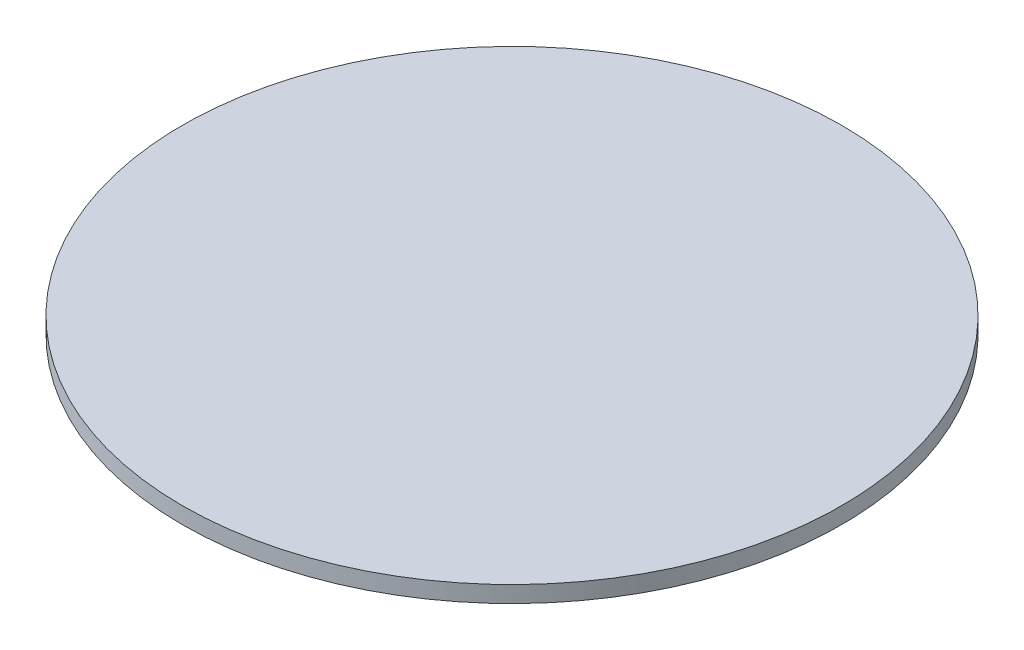
ISO-10303-21;
HEADER;
FILE_DESCRIPTION(('STEP AP214'),'2;1');
FILE_NAME('part.step','',(''),(''),'','','');
FILE_SCHEMA(('AUTOMOTIVE_DESIGN { 1 0 10303 214 1 1 1 1 }'));
ENDSEC;
DATA;
#1=APPLICATION_CONTEXT('core data for automotive mechanical design processes');
#2=APPLICATION_PROTOCOL_DEFINITION('international standard','automotive_design',2000,#1);
#3=PRODUCT_CONTEXT('',#1,'mechanical');
#4=PRODUCT('Part','Part','',(#3));
#5=PRODUCT_RELATED_PRODUCT_CATEGORY('part','',(#4));
#6=PRODUCT_DEFINITION_FORMATION('','',#4);
#7=PRODUCT_DEFINITION_CONTEXT('part definition',#1,'design');
#8=PRODUCT_DEFINITION('design','',#6,#7);
#9=PRODUCT_DEFINITION_SHAPE('','',#8);
#10=(LENGTH_UNIT() NAMED_UNIT(*) SI_UNIT(.MILLI.,.METRE.));
#11=(NAMED_UNIT(*) PLANE_ANGLE_UNIT() SI_UNIT($,.RADIAN.));
#12=(NAMED_UNIT(*) SI_UNIT($,.STERADIAN.) SOLID_ANGLE_UNIT());
#13=UNCERTAINTY_MEASURE_WITH_UNIT(LENGTH_MEASURE(1.E-05),#10,'distance_accuracy_value','');
#14=(GEOMETRIC_REPRESENTATION_CONTEXT(3) GLOBAL_UNCERTAINTY_ASSIGNED_CONTEXT((#13)) GLOBAL_UNIT_ASSIGNED_CONTEXT((#10,
#11,#12)) REPRESENTATION_CONTEXT('',''));
#15=CARTESIAN_POINT('',(0.,0.,0.));
#16=DIRECTION('',(0.,0.,1.));
#17=DIRECTION('',(1.,0.,0.));
#18=AXIS2_PLACEMENT_3D('',#15,#16,#17);
#19=CARTESIAN_POINT('',(0.,2.54,0.));
#20=DIRECTION('',(0.,-1.,0.));
#21=DIRECTION('',(0.,0.,-1.));
#22=AXIS2_PLACEMENT_3D('',#19,#20,#21);
#23=CYLINDRICAL_SURFACE('',#22,101.6);
#24=CARTESIAN_POINT('',(0.,2.54,0.));
#25=DIRECTION('',(0.,1.,0.));
#26=DIRECTION('',(0.,0.,1.));
#27=AXIS2_PLACEMENT_3D('',#24,#25,#26);
#28=CIRCLE('',#27,101.6);
#29=CARTESIAN_POINT('',(0.,2.54,101.6));
#30=VERTEX_POINT('',#29);
#31=EDGE_CURVE('E10',#30,#30,#28,.T.);
#32=ORIENTED_EDGE('',*,*,#31,.F.);
#33=EDGE_LOOP('',(#32));
#34=FACE_BOUND('',#33,.T.);
#35=CARTESIAN_POINT('',(0.,-2.54,0.));
#36=DIRECTION('',(0.,1.,0.));
#37=DIRECTION('',(0.,0.,1.));
#38=AXIS2_PLACEMENT_3D('',#35,#36,#37);
#39=CIRCLE('',#38,101.6);
#40=CARTESIAN_POINT('',(0.,-2.54,101.6));
#41=VERTEX_POINT('',#40);
#42=EDGE_CURVE('E38',#41,#41,#39,.T.);
#43=ORIENTED_EDGE('',*,*,#42,.T.);
#44=EDGE_LOOP('',(#43));
#45=FACE_BOUND('',#44,.T.);
#46=ADVANCED_FACE('F35',(#34,#45),#23,.T.);
#47=CARTESIAN_POINT('',(0.,2.54,0.));
#48=DIRECTION('',(0.,1.,0.));
#49=DIRECTION('',(0.,0.,1.));
#50=AXIS2_PLACEMENT_3D('',#47,#48,#49);
#51=PLANE('',#50);
#52=ORIENTED_EDGE('',*,*,#31,.T.);
#53=EDGE_LOOP('',(#52));
#54=FACE_BOUND('',#53,.T.);
#55=ADVANCED_FACE('F50',(#54),#51,.T.);
#56=CARTESIAN_POINT('',(0.,-2.54,0.));
#57=DIRECTION('',(0.,1.,0.));
#58=DIRECTION('',(0.,0.,1.));
#59=AXIS2_PLACEMENT_3D('',#56,#57,#58);
#60=PLANE('',#59);
#61=ORIENTED_EDGE('',*,*,#42,.F.);
#62=EDGE_LOOP('',(#61));
#63=FACE_BOUND('',#62,.T.);
#64=ADVANCED_FACE('F48',(#63),#60,.F.);
#65=CLOSED_SHELL('',(#46,#55,#64));
#66=MANIFOLD_SOLID_BREP('B2',#65);
#67=ADVANCED_BREP_SHAPE_REPRESENTATION('',(#18,#66),#14);
#68=SHAPE_DEFINITION_REPRESENTATION(#9,#67);
ENDSEC;
END-ISO-10303-21;
